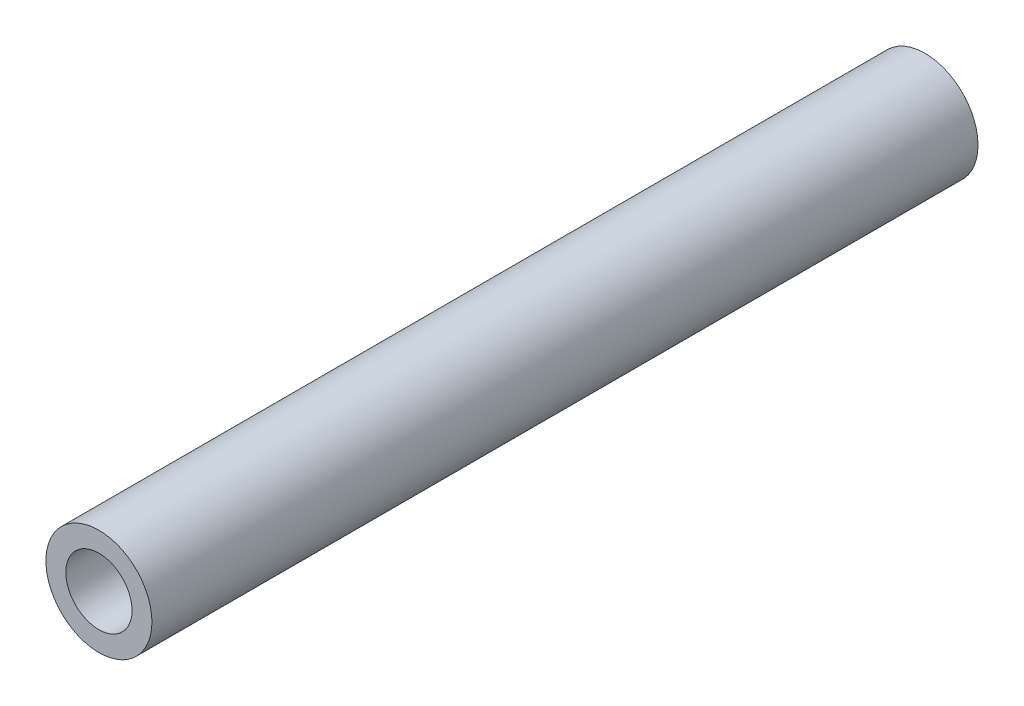
ISO-10303-21;
HEADER;
FILE_DESCRIPTION(('STEP AP214'),'2;1');
FILE_NAME('part.step','',(''),(''),'','','');
FILE_SCHEMA(('AUTOMOTIVE_DESIGN { 1 0 10303 214 1 1 1 1 }'));
ENDSEC;
DATA;
#1=APPLICATION_CONTEXT('core data for automotive mechanical design processes');
#2=APPLICATION_PROTOCOL_DEFINITION('international standard','automotive_design',2000,#1);
#3=PRODUCT_CONTEXT('',#1,'mechanical');
#4=PRODUCT('Part','Part','',(#3));
#5=PRODUCT_RELATED_PRODUCT_CATEGORY('part','',(#4));
#6=PRODUCT_DEFINITION_FORMATION('','',#4);
#7=PRODUCT_DEFINITION_CONTEXT('part definition',#1,'design');
#8=PRODUCT_DEFINITION('design','',#6,#7);
#9=PRODUCT_DEFINITION_SHAPE('','',#8);
#10=(LENGTH_UNIT() NAMED_UNIT(*) SI_UNIT(.MILLI.,.METRE.));
#11=(NAMED_UNIT(*) PLANE_ANGLE_UNIT() SI_UNIT($,.RADIAN.));
#12=(NAMED_UNIT(*) SI_UNIT($,.STERADIAN.) SOLID_ANGLE_UNIT());
#13=UNCERTAINTY_MEASURE_WITH_UNIT(LENGTH_MEASURE(1.E-05),#10,'distance_accuracy_value','');
#14=(GEOMETRIC_REPRESENTATION_CONTEXT(3) GLOBAL_UNCERTAINTY_ASSIGNED_CONTEXT((#13)) GLOBAL_UNIT_ASSIGNED_CONTEXT((#10,
#11,#12)) REPRESENTATION_CONTEXT('',''));
#15=CARTESIAN_POINT('',(0.,0.,0.));
#16=DIRECTION('',(0.,0.,1.));
#17=DIRECTION('',(1.,0.,0.));
#18=AXIS2_PLACEMENT_3D('',#15,#16,#17);
#19=CARTESIAN_POINT('',(0.,0.,187.));
#20=DIRECTION('',(0.,0.,1.));
#21=DIRECTION('',(1.,0.,0.));
#22=AXIS2_PLACEMENT_3D('',#19,#20,#21);
#23=PLANE('',#22);
#24=CARTESIAN_POINT('',(0.,0.,187.));
#25=DIRECTION('',(0.,0.,1.));
#26=DIRECTION('',(1.,0.,0.));
#27=AXIS2_PLACEMENT_3D('',#24,#25,#26);
#28=CIRCLE('',#27,12.);
#29=CARTESIAN_POINT('',(12.,0.,187.));
#30=VERTEX_POINT('',#29);
#31=EDGE_CURVE('E10',#30,#30,#28,.T.);
#32=ORIENTED_EDGE('',*,*,#31,.T.);
#33=EDGE_LOOP('',(#32));
#34=FACE_BOUND('',#33,.T.);
#35=CARTESIAN_POINT('',(0.,0.,187.));
#36=DIRECTION('',(0.,0.,1.));
#37=DIRECTION('',(1.,0.,0.));
#38=AXIS2_PLACEMENT_3D('',#35,#36,#37);
#39=CIRCLE('',#38,7.5);
#40=CARTESIAN_POINT('',(7.5,0.,187.));
#41=VERTEX_POINT('',#40);
#42=EDGE_CURVE('E44',#41,#41,#39,.T.);
#43=ORIENTED_EDGE('',*,*,#42,.F.);
#44=EDGE_LOOP('',(#43));
#45=FACE_BOUND('',#44,.T.);
#46=ADVANCED_FACE('F33',(#34,#45),#23,.T.);
#47=CARTESIAN_POINT('',(0.,0.,0.));
#48=DIRECTION('',(0.,0.,1.));
#49=DIRECTION('',(1.,0.,0.));
#50=AXIS2_PLACEMENT_3D('',#47,#48,#49);
#51=PLANE('',#50);
#52=CARTESIAN_POINT('',(0.,0.,0.));
#53=DIRECTION('',(0.,0.,1.));
#54=DIRECTION('',(1.,0.,0.));
#55=AXIS2_PLACEMENT_3D('',#52,#53,#54);
#56=CIRCLE('',#55,12.);
#57=CARTESIAN_POINT('',(12.,0.,0.));
#58=VERTEX_POINT('',#57);
#59=EDGE_CURVE('E37',#58,#58,#56,.T.);
#60=ORIENTED_EDGE('',*,*,#59,.F.);
#61=EDGE_LOOP('',(#60));
#62=FACE_BOUND('',#61,.T.);
#63=CARTESIAN_POINT('',(0.,0.,0.));
#64=DIRECTION('',(0.,0.,1.));
#65=DIRECTION('',(1.,0.,0.));
#66=AXIS2_PLACEMENT_3D('',#63,#64,#65);
#67=CIRCLE('',#66,7.5);
#68=CARTESIAN_POINT('',(7.5,0.,0.));
#69=VERTEX_POINT('',#68);
#70=EDGE_CURVE('E46',#69,#69,#67,.T.);
#71=ORIENTED_EDGE('',*,*,#70,.T.);
#72=EDGE_LOOP('',(#71));
#73=FACE_BOUND('',#72,.T.);
#74=ADVANCED_FACE('F56',(#62,#73),#51,.F.);
#75=CARTESIAN_POINT('',(0.,0.,187.));
#76=DIRECTION('',(0.,0.,-1.));
#77=DIRECTION('',(-1.,0.,0.));
#78=AXIS2_PLACEMENT_3D('',#75,#76,#77);
#79=CYLINDRICAL_SURFACE('',#78,12.);
#80=ORIENTED_EDGE('',*,*,#31,.F.);
#81=EDGE_LOOP('',(#80));
#82=FACE_BOUND('',#81,.T.);
#83=ORIENTED_EDGE('',*,*,#59,.T.);
#84=EDGE_LOOP('',(#83));
#85=FACE_BOUND('',#84,.T.);
#86=ADVANCED_FACE('F35',(#82,#85),#79,.T.);
#87=CARTESIAN_POINT('',(0.,0.,187.));
#88=DIRECTION('',(0.,0.,-1.));
#89=DIRECTION('',(-1.,0.,0.));
#90=AXIS2_PLACEMENT_3D('',#87,#88,#89);
#91=CYLINDRICAL_SURFACE('',#90,7.5);
#92=ORIENTED_EDGE('',*,*,#42,.T.);
#93=EDGE_LOOP('',(#92));
#94=FACE_BOUND('',#93,.T.);
#95=ORIENTED_EDGE('',*,*,#70,.F.);
#96=EDGE_LOOP('',(#95));
#97=FACE_BOUND('',#96,.T.);
#98=ADVANCED_FACE('F52',(#94,#97),#91,.F.);
#99=CLOSED_SHELL('',(#46,#74,#86,#98));
#100=MANIFOLD_SOLID_BREP('B2',#99);
#101=ADVANCED_BREP_SHAPE_REPRESENTATION('',(#18,#100),#14);
#102=SHAPE_DEFINITION_REPRESENTATION(#9,#101);
ENDSEC;
END-ISO-10303-21;
